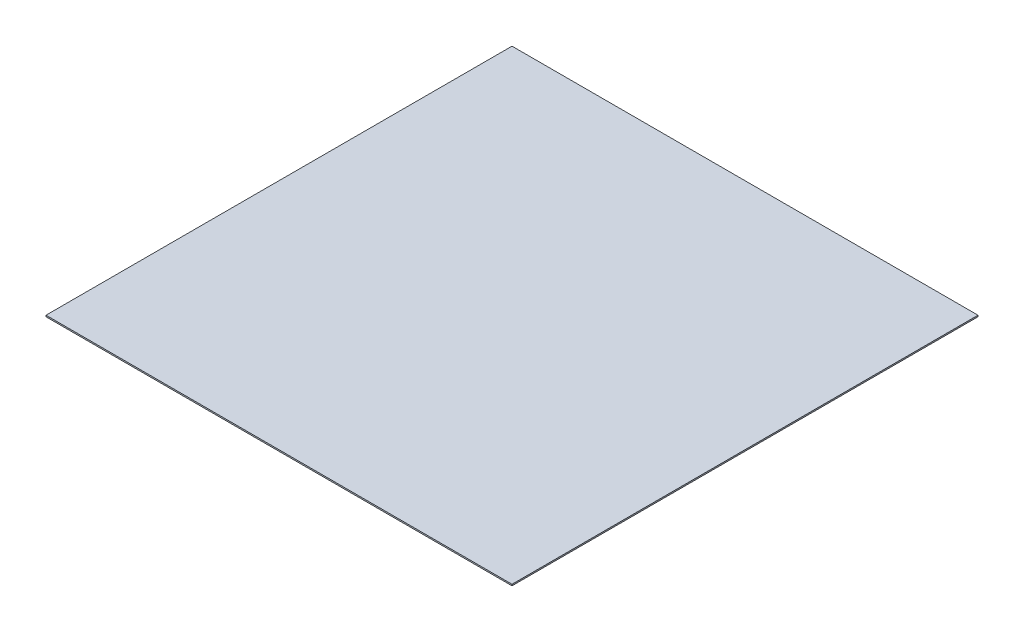
ISO-10303-21;
HEADER;
FILE_DESCRIPTION(('STEP AP214'),'2;1');
FILE_NAME('part.step','',(''),(''),'','','');
FILE_SCHEMA(('AUTOMOTIVE_DESIGN { 1 0 10303 214 1 1 1 1 }'));
ENDSEC;
DATA;
#1=APPLICATION_CONTEXT('core data for automotive mechanical design processes');
#2=APPLICATION_PROTOCOL_DEFINITION('international standard','automotive_design',2000,#1);
#3=PRODUCT_CONTEXT('',#1,'mechanical');
#4=PRODUCT('Part','Part','',(#3));
#5=PRODUCT_RELATED_PRODUCT_CATEGORY('part','',(#4));
#6=PRODUCT_DEFINITION_FORMATION('','',#4);
#7=PRODUCT_DEFINITION_CONTEXT('part definition',#1,'design');
#8=PRODUCT_DEFINITION('design','',#6,#7);
#9=PRODUCT_DEFINITION_SHAPE('','',#8);
#10=(LENGTH_UNIT() NAMED_UNIT(*) SI_UNIT(.MILLI.,.METRE.));
#11=(NAMED_UNIT(*) PLANE_ANGLE_UNIT() SI_UNIT($,.RADIAN.));
#12=(NAMED_UNIT(*) SI_UNIT($,.STERADIAN.) SOLID_ANGLE_UNIT());
#13=UNCERTAINTY_MEASURE_WITH_UNIT(LENGTH_MEASURE(1.E-05),#10,'distance_accuracy_value','');
#14=(GEOMETRIC_REPRESENTATION_CONTEXT(3) GLOBAL_UNCERTAINTY_ASSIGNED_CONTEXT((#13)) GLOBAL_UNIT_ASSIGNED_CONTEXT((#10,
#11,#12)) REPRESENTATION_CONTEXT('',''));
#15=CARTESIAN_POINT('',(0.,0.,0.));
#16=DIRECTION('',(0.,0.,1.));
#17=DIRECTION('',(1.,0.,0.));
#18=AXIS2_PLACEMENT_3D('',#15,#16,#17);
#19=CARTESIAN_POINT('',(500.,-3.,500.));
#20=DIRECTION('',(1.,0.,0.));
#21=DIRECTION('',(0.,0.,-1.));
#22=AXIS2_PLACEMENT_3D('',#19,#20,#21);
#23=PLANE('',#22);
#24=DIRECTION('',(0.,0.,-1.));
#25=VECTOR('',#24,1.);
#26=CARTESIAN_POINT('',(500.,0.,500.));
#27=LINE('',#26,#25);
#28=CARTESIAN_POINT('',(500.,0.,500.));
#29=VERTEX_POINT('',#28);
#30=CARTESIAN_POINT('',(500.,0.,-500.));
#31=VERTEX_POINT('',#30);
#32=EDGE_CURVE('E101',#29,#31,#27,.T.);
#33=ORIENTED_EDGE('',*,*,#32,.F.);
#34=DIRECTION('',(0.,1.,0.));
#35=VECTOR('',#34,1.);
#36=CARTESIAN_POINT('',(500.,-3.,500.));
#37=LINE('',#36,#35);
#38=CARTESIAN_POINT('',(500.,-3.,500.));
#39=VERTEX_POINT('',#38);
#40=EDGE_CURVE('E11',#39,#29,#37,.T.);
#41=ORIENTED_EDGE('',*,*,#40,.F.);
#42=DIRECTION('',(0.,0.,-1.));
#43=VECTOR('',#42,1.);
#44=CARTESIAN_POINT('',(500.,-3.,500.));
#45=LINE('',#44,#43);
#46=CARTESIAN_POINT('',(500.,-3.,-500.));
#47=VERTEX_POINT('',#46);
#48=EDGE_CURVE('E95',#39,#47,#45,.T.);
#49=ORIENTED_EDGE('',*,*,#48,.T.);
#50=DIRECTION('',(0.,1.,0.));
#51=VECTOR('',#50,1.);
#52=CARTESIAN_POINT('',(500.,-3.,-500.));
#53=LINE('',#52,#51);
#54=EDGE_CURVE('E40',#47,#31,#53,.T.);
#55=ORIENTED_EDGE('',*,*,#54,.T.);
#56=EDGE_LOOP('',(#33,#41,#49,#55));
#57=FACE_BOUND('',#56,.T.);
#58=ADVANCED_FACE('F37',(#57),#23,.T.);
#59=CARTESIAN_POINT('',(-500.,-3.,500.));
#60=DIRECTION('',(0.,0.,1.));
#61=DIRECTION('',(1.,0.,0.));
#62=AXIS2_PLACEMENT_3D('',#59,#60,#61);
#63=PLANE('',#62);
#64=DIRECTION('',(1.,0.,0.));
#65=VECTOR('',#64,1.);
#66=CARTESIAN_POINT('',(-500.,0.,500.));
#67=LINE('',#66,#65);
#68=CARTESIAN_POINT('',(-500.,0.,500.));
#69=VERTEX_POINT('',#68);
#70=EDGE_CURVE('E97',#69,#29,#67,.T.);
#71=ORIENTED_EDGE('',*,*,#70,.F.);
#72=DIRECTION('',(0.,1.,0.));
#73=VECTOR('',#72,1.);
#74=CARTESIAN_POINT('',(-500.,-3.,500.));
#75=LINE('',#74,#73);
#76=CARTESIAN_POINT('',(-500.,-3.,500.));
#77=VERTEX_POINT('',#76);
#78=EDGE_CURVE('E46',#77,#69,#75,.T.);
#79=ORIENTED_EDGE('',*,*,#78,.F.);
#80=DIRECTION('',(1.,0.,0.));
#81=VECTOR('',#80,1.);
#82=CARTESIAN_POINT('',(-500.,-3.,500.));
#83=LINE('',#82,#81);
#84=EDGE_CURVE('E92',#77,#39,#83,.T.);
#85=ORIENTED_EDGE('',*,*,#84,.T.);
#86=ORIENTED_EDGE('',*,*,#40,.T.);
#87=EDGE_LOOP('',(#71,#79,#85,#86));
#88=FACE_BOUND('',#87,.T.);
#89=ADVANCED_FACE('F111',(#88),#63,.T.);
#90=CARTESIAN_POINT('',(-500.,-3.,500.));
#91=DIRECTION('',(-1.,0.,0.));
#92=DIRECTION('',(0.,0.,1.));
#93=AXIS2_PLACEMENT_3D('',#90,#91,#92);
#94=PLANE('',#93);
#95=DIRECTION('',(0.,0.,1.));
#96=VECTOR('',#95,1.);
#97=CARTESIAN_POINT('',(-500.,0.,500.));
#98=LINE('',#97,#96);
#99=CARTESIAN_POINT('',(-500.,0.,-500.));
#100=VERTEX_POINT('',#99);
#101=EDGE_CURVE('E87',#100,#69,#98,.T.);
#102=ORIENTED_EDGE('',*,*,#101,.F.);
#103=DIRECTION('',(0.,1.,0.));
#104=VECTOR('',#103,1.);
#105=CARTESIAN_POINT('',(-500.,-3.,-500.));
#106=LINE('',#105,#104);
#107=CARTESIAN_POINT('',(-500.,-3.,-500.));
#108=VERTEX_POINT('',#107);
#109=EDGE_CURVE('E82',#108,#100,#106,.T.);
#110=ORIENTED_EDGE('',*,*,#109,.F.);
#111=DIRECTION('',(0.,0.,1.));
#112=VECTOR('',#111,1.);
#113=CARTESIAN_POINT('',(-500.,-3.,500.));
#114=LINE('',#113,#112);
#115=EDGE_CURVE('E85',#108,#77,#114,.T.);
#116=ORIENTED_EDGE('',*,*,#115,.T.);
#117=ORIENTED_EDGE('',*,*,#78,.T.);
#118=EDGE_LOOP('',(#102,#110,#116,#117));
#119=FACE_BOUND('',#118,.T.);
#120=ADVANCED_FACE('F84',(#119),#94,.T.);
#121=CARTESIAN_POINT('',(-500.,-3.,-500.));
#122=DIRECTION('',(0.,0.,-1.));
#123=DIRECTION('',(-1.,0.,0.));
#124=AXIS2_PLACEMENT_3D('',#121,#122,#123);
#125=PLANE('',#124);
#126=DIRECTION('',(-1.,0.,0.));
#127=VECTOR('',#126,1.);
#128=CARTESIAN_POINT('',(-500.,0.,-500.));
#129=LINE('',#128,#127);
#130=EDGE_CURVE('E104',#31,#100,#129,.T.);
#131=ORIENTED_EDGE('',*,*,#130,.F.);
#132=ORIENTED_EDGE('',*,*,#54,.F.);
#133=DIRECTION('',(-1.,0.,0.));
#134=VECTOR('',#133,1.);
#135=CARTESIAN_POINT('',(-500.,-3.,-500.));
#136=LINE('',#135,#134);
#137=EDGE_CURVE('E91',#47,#108,#136,.T.);
#138=ORIENTED_EDGE('',*,*,#137,.T.);
#139=ORIENTED_EDGE('',*,*,#109,.T.);
#140=EDGE_LOOP('',(#131,#132,#138,#139));
#141=FACE_BOUND('',#140,.T.);
#142=ADVANCED_FACE('F94',(#141),#125,.T.);
#143=CARTESIAN_POINT('',(0.,-3.,0.));
#144=DIRECTION('',(0.,-1.,0.));
#145=DIRECTION('',(0.,0.,-1.));
#146=AXIS2_PLACEMENT_3D('',#143,#144,#145);
#147=PLANE('',#146);
#148=ORIENTED_EDGE('',*,*,#48,.F.);
#149=ORIENTED_EDGE('',*,*,#84,.F.);
#150=ORIENTED_EDGE('',*,*,#115,.F.);
#151=ORIENTED_EDGE('',*,*,#137,.F.);
#152=EDGE_LOOP('',(#148,#149,#150,#151));
#153=FACE_BOUND('',#152,.T.);
#154=ADVANCED_FACE('F90',(#153),#147,.T.);
#155=CARTESIAN_POINT('',(0.,0.,0.));
#156=DIRECTION('',(0.,-1.,0.));
#157=DIRECTION('',(0.,0.,-1.));
#158=AXIS2_PLACEMENT_3D('',#155,#156,#157);
#159=PLANE('',#158);
#160=ORIENTED_EDGE('',*,*,#32,.T.);
#161=ORIENTED_EDGE('',*,*,#130,.T.);
#162=ORIENTED_EDGE('',*,*,#101,.T.);
#163=ORIENTED_EDGE('',*,*,#70,.T.);
#164=EDGE_LOOP('',(#160,#161,#162,#163));
#165=FACE_BOUND('',#164,.T.);
#166=ADVANCED_FACE('F110',(#165),#159,.F.);
#167=CLOSED_SHELL('',(#58,#89,#120,#142,#154,#166));
#168=MANIFOLD_SOLID_BREP('B2',#167);
#169=ADVANCED_BREP_SHAPE_REPRESENTATION('',(#18,#168),#14);
#170=SHAPE_DEFINITION_REPRESENTATION(#9,#169);
ENDSEC;
END-ISO-10303-21;
